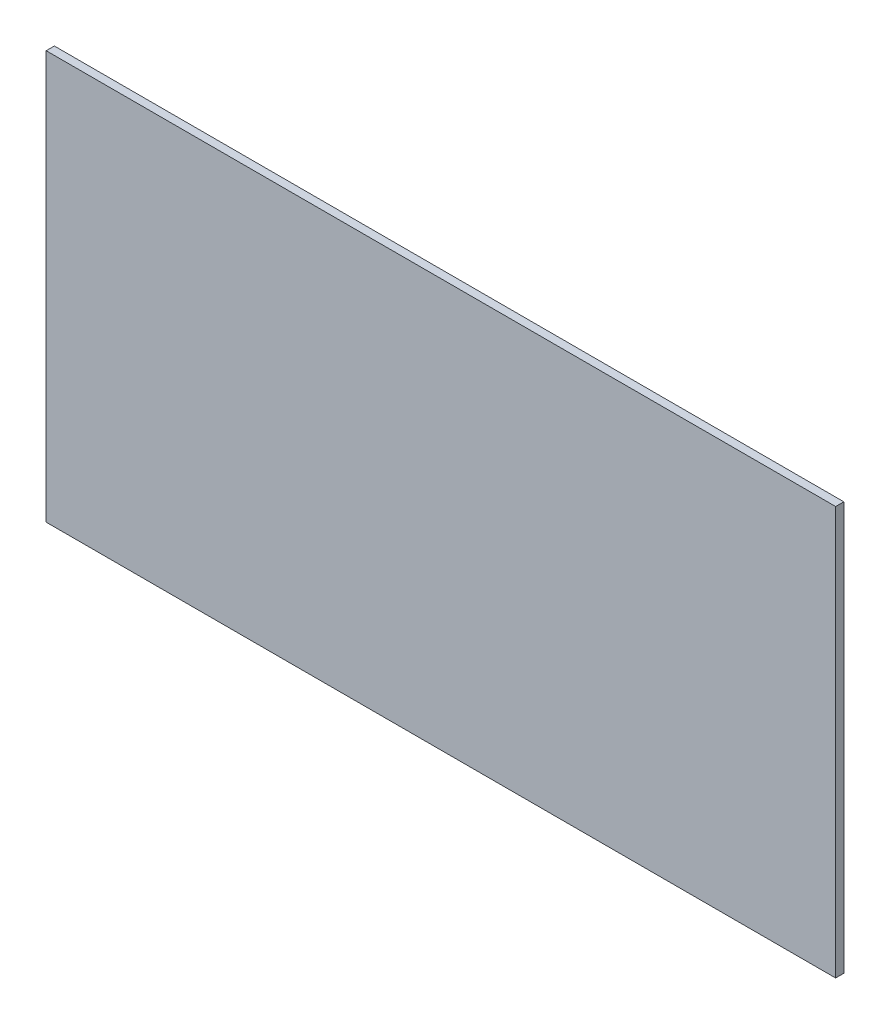
ISO-10303-21;
HEADER;
FILE_DESCRIPTION(('STEP AP214'),'2;1');
FILE_NAME('part.step','',(''),(''),'','','');
FILE_SCHEMA(('AUTOMOTIVE_DESIGN { 1 0 10303 214 1 1 1 1 }'));
ENDSEC;
DATA;
#1=APPLICATION_CONTEXT('core data for automotive mechanical design processes');
#2=APPLICATION_PROTOCOL_DEFINITION('international standard','automotive_design',2000,#1);
#3=PRODUCT_CONTEXT('',#1,'mechanical');
#4=PRODUCT('Part','Part','',(#3));
#5=PRODUCT_RELATED_PRODUCT_CATEGORY('part','',(#4));
#6=PRODUCT_DEFINITION_FORMATION('','',#4);
#7=PRODUCT_DEFINITION_CONTEXT('part definition',#1,'design');
#8=PRODUCT_DEFINITION('design','',#6,#7);
#9=PRODUCT_DEFINITION_SHAPE('','',#8);
#10=(LENGTH_UNIT() NAMED_UNIT(*) SI_UNIT(.MILLI.,.METRE.));
#11=(NAMED_UNIT(*) PLANE_ANGLE_UNIT() SI_UNIT($,.RADIAN.));
#12=(NAMED_UNIT(*) SI_UNIT($,.STERADIAN.) SOLID_ANGLE_UNIT());
#13=UNCERTAINTY_MEASURE_WITH_UNIT(LENGTH_MEASURE(1.E-05),#10,'distance_accuracy_value','');
#14=(GEOMETRIC_REPRESENTATION_CONTEXT(3) GLOBAL_UNCERTAINTY_ASSIGNED_CONTEXT((#13)) GLOBAL_UNIT_ASSIGNED_CONTEXT((#10,
#11,#12)) REPRESENTATION_CONTEXT('',''));
#15=CARTESIAN_POINT('',(0.,0.,0.));
#16=DIRECTION('',(0.,0.,1.));
#17=DIRECTION('',(1.,0.,0.));
#18=AXIS2_PLACEMENT_3D('',#15,#16,#17);
#19=CARTESIAN_POINT('',(145.,75.,3.));
#20=DIRECTION('',(-1.,0.,0.));
#21=DIRECTION('',(0.,-1.,0.));
#22=AXIS2_PLACEMENT_3D('',#19,#20,#21);
#23=PLANE('',#22);
#24=DIRECTION('',(0.,1.,0.));
#25=VECTOR('',#24,1.);
#26=CARTESIAN_POINT('',(145.,75.,0.));
#27=LINE('',#26,#25);
#28=CARTESIAN_POINT('',(145.,-75.,0.));
#29=VERTEX_POINT('',#28);
#30=CARTESIAN_POINT('',(145.,75.,0.));
#31=VERTEX_POINT('',#30);
#32=EDGE_CURVE('E95',#29,#31,#27,.T.);
#33=ORIENTED_EDGE('',*,*,#32,.T.);
#34=DIRECTION('',(0.,0.,-1.));
#35=VECTOR('',#34,1.);
#36=CARTESIAN_POINT('',(145.,75.,3.));
#37=LINE('',#36,#35);
#38=CARTESIAN_POINT('',(145.,75.,3.));
#39=VERTEX_POINT('',#38);
#40=EDGE_CURVE('E11',#39,#31,#37,.T.);
#41=ORIENTED_EDGE('',*,*,#40,.F.);
#42=DIRECTION('',(0.,1.,0.));
#43=VECTOR('',#42,1.);
#44=CARTESIAN_POINT('',(145.,75.,3.));
#45=LINE('',#44,#43);
#46=CARTESIAN_POINT('',(145.,-75.,3.));
#47=VERTEX_POINT('',#46);
#48=EDGE_CURVE('E83',#47,#39,#45,.T.);
#49=ORIENTED_EDGE('',*,*,#48,.F.);
#50=DIRECTION('',(0.,0.,-1.));
#51=VECTOR('',#50,1.);
#52=CARTESIAN_POINT('',(145.,-75.,3.));
#53=LINE('',#52,#51);
#54=EDGE_CURVE('E91',#47,#29,#53,.T.);
#55=ORIENTED_EDGE('',*,*,#54,.T.);
#56=EDGE_LOOP('',(#33,#41,#49,#55));
#57=FACE_BOUND('',#56,.T.);
#58=ADVANCED_FACE('F32',(#57),#23,.F.);
#59=CARTESIAN_POINT('',(-145.,75.,3.));
#60=DIRECTION('',(0.,-1.,0.));
#61=DIRECTION('',(0.,0.,-1.));
#62=AXIS2_PLACEMENT_3D('',#59,#60,#61);
#63=PLANE('',#62);
#64=DIRECTION('',(-1.,0.,0.));
#65=VECTOR('',#64,1.);
#66=CARTESIAN_POINT('',(-145.,75.,0.));
#67=LINE('',#66,#65);
#68=CARTESIAN_POINT('',(-145.,75.,0.));
#69=VERTEX_POINT('',#68);
#70=EDGE_CURVE('E87',#31,#69,#67,.T.);
#71=ORIENTED_EDGE('',*,*,#70,.T.);
#72=DIRECTION('',(0.,0.,-1.));
#73=VECTOR('',#72,1.);
#74=CARTESIAN_POINT('',(-145.,75.,3.));
#75=LINE('',#74,#73);
#76=CARTESIAN_POINT('',(-145.,75.,3.));
#77=VERTEX_POINT('',#76);
#78=EDGE_CURVE('E40',#77,#69,#75,.T.);
#79=ORIENTED_EDGE('',*,*,#78,.F.);
#80=DIRECTION('',(-1.,0.,0.));
#81=VECTOR('',#80,1.);
#82=CARTESIAN_POINT('',(-145.,75.,3.));
#83=LINE('',#82,#81);
#84=EDGE_CURVE('E78',#39,#77,#83,.T.);
#85=ORIENTED_EDGE('',*,*,#84,.F.);
#86=ORIENTED_EDGE('',*,*,#40,.T.);
#87=EDGE_LOOP('',(#71,#79,#85,#86));
#88=FACE_BOUND('',#87,.T.);
#89=ADVANCED_FACE('F86',(#88),#63,.F.);
#90=CARTESIAN_POINT('',(-145.,75.,3.));
#91=DIRECTION('',(1.,0.,0.));
#92=DIRECTION('',(0.,1.,0.));
#93=AXIS2_PLACEMENT_3D('',#90,#91,#92);
#94=PLANE('',#93);
#95=DIRECTION('',(0.,-1.,0.));
#96=VECTOR('',#95,1.);
#97=CARTESIAN_POINT('',(-145.,75.,0.));
#98=LINE('',#97,#96);
#99=CARTESIAN_POINT('',(-145.,-75.,0.));
#100=VERTEX_POINT('',#99);
#101=EDGE_CURVE('E65',#69,#100,#98,.T.);
#102=ORIENTED_EDGE('',*,*,#101,.T.);
#103=DIRECTION('',(0.,0.,-1.));
#104=VECTOR('',#103,1.);
#105=CARTESIAN_POINT('',(-145.,-75.,3.));
#106=LINE('',#105,#104);
#107=CARTESIAN_POINT('',(-145.,-75.,3.));
#108=VERTEX_POINT('',#107);
#109=EDGE_CURVE('E88',#108,#100,#106,.T.);
#110=ORIENTED_EDGE('',*,*,#109,.F.);
#111=DIRECTION('',(0.,-1.,0.));
#112=VECTOR('',#111,1.);
#113=CARTESIAN_POINT('',(-145.,75.,3.));
#114=LINE('',#113,#112);
#115=EDGE_CURVE('E81',#77,#108,#114,.T.);
#116=ORIENTED_EDGE('',*,*,#115,.F.);
#117=ORIENTED_EDGE('',*,*,#78,.T.);
#118=EDGE_LOOP('',(#102,#110,#116,#117));
#119=FACE_BOUND('',#118,.T.);
#120=ADVANCED_FACE('F89',(#119),#94,.F.);
#121=CARTESIAN_POINT('',(-145.,-75.,3.));
#122=DIRECTION('',(0.,1.,0.));
#123=DIRECTION('',(0.,0.,1.));
#124=AXIS2_PLACEMENT_3D('',#121,#122,#123);
#125=PLANE('',#124);
#126=DIRECTION('',(1.,0.,0.));
#127=VECTOR('',#126,1.);
#128=CARTESIAN_POINT('',(-145.,-75.,0.));
#129=LINE('',#128,#127);
#130=EDGE_CURVE('E71',#100,#29,#129,.T.);
#131=ORIENTED_EDGE('',*,*,#130,.T.);
#132=ORIENTED_EDGE('',*,*,#54,.F.);
#133=DIRECTION('',(1.,0.,0.));
#134=VECTOR('',#133,1.);
#135=CARTESIAN_POINT('',(-145.,-75.,3.));
#136=LINE('',#135,#134);
#137=EDGE_CURVE('E48',#108,#47,#136,.T.);
#138=ORIENTED_EDGE('',*,*,#137,.F.);
#139=ORIENTED_EDGE('',*,*,#109,.T.);
#140=EDGE_LOOP('',(#131,#132,#138,#139));
#141=FACE_BOUND('',#140,.T.);
#142=ADVANCED_FACE('F102',(#141),#125,.F.);
#143=CARTESIAN_POINT('',(0.,0.,3.));
#144=DIRECTION('',(0.,0.,1.));
#145=DIRECTION('',(1.,0.,0.));
#146=AXIS2_PLACEMENT_3D('',#143,#144,#145);
#147=PLANE('',#146);
#148=ORIENTED_EDGE('',*,*,#48,.T.);
#149=ORIENTED_EDGE('',*,*,#84,.T.);
#150=ORIENTED_EDGE('',*,*,#115,.T.);
#151=ORIENTED_EDGE('',*,*,#137,.T.);
#152=EDGE_LOOP('',(#148,#149,#150,#151));
#153=FACE_BOUND('',#152,.T.);
#154=ADVANCED_FACE('F79',(#153),#147,.T.);
#155=CARTESIAN_POINT('',(0.,0.,0.));
#156=DIRECTION('',(0.,0.,1.));
#157=DIRECTION('',(1.,0.,0.));
#158=AXIS2_PLACEMENT_3D('',#155,#156,#157);
#159=PLANE('',#158);
#160=ORIENTED_EDGE('',*,*,#32,.F.);
#161=ORIENTED_EDGE('',*,*,#130,.F.);
#162=ORIENTED_EDGE('',*,*,#101,.F.);
#163=ORIENTED_EDGE('',*,*,#70,.F.);
#164=EDGE_LOOP('',(#160,#161,#162,#163));
#165=FACE_BOUND('',#164,.T.);
#166=ADVANCED_FACE('F105',(#165),#159,.F.);
#167=CLOSED_SHELL('',(#58,#89,#120,#142,#154,#166));
#168=MANIFOLD_SOLID_BREP('B2',#167);
#169=ADVANCED_BREP_SHAPE_REPRESENTATION('',(#18,#168),#14);
#170=SHAPE_DEFINITION_REPRESENTATION(#9,#169);
ENDSEC;
END-ISO-10303-21;
